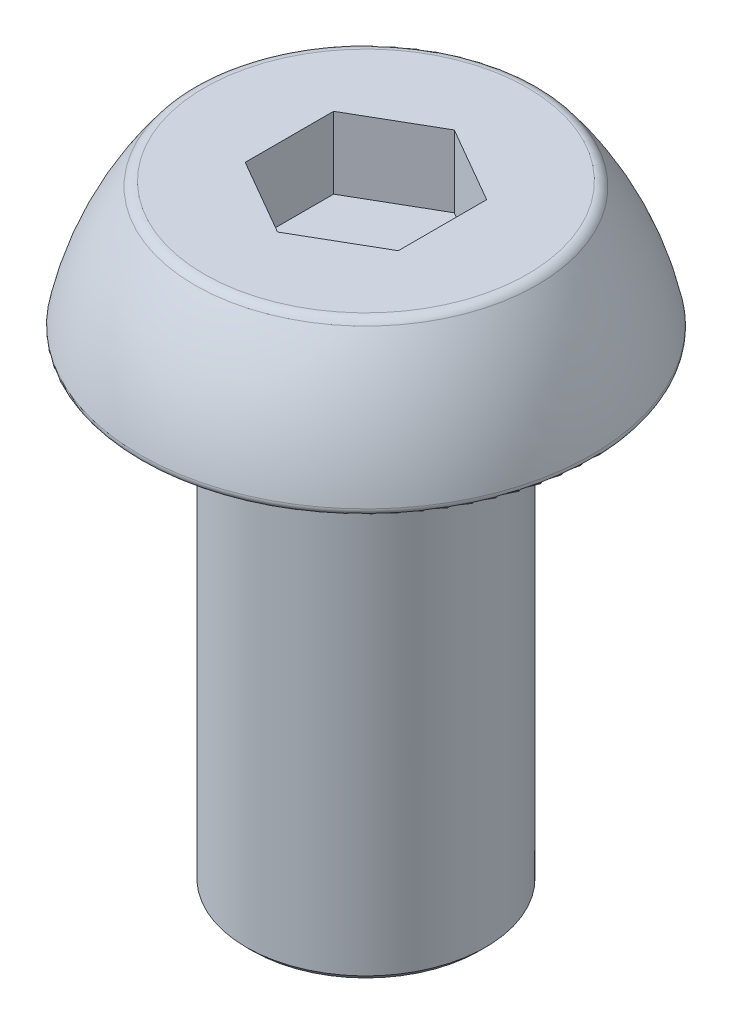
ISO-10303-21;
HEADER;
FILE_DESCRIPTION(('STEP AP214'),'2;1');
FILE_NAME('part.step','',(''),(''),'','','');
FILE_SCHEMA(('AUTOMOTIVE_DESIGN { 1 0 10303 214 1 1 1 1 }'));
ENDSEC;
DATA;
#1=APPLICATION_CONTEXT('core data for automotive mechanical design processes');
#2=APPLICATION_PROTOCOL_DEFINITION('international standard','automotive_design',2000,#1);
#3=PRODUCT_CONTEXT('',#1,'mechanical');
#4=PRODUCT('Part','Part','',(#3));
#5=PRODUCT_RELATED_PRODUCT_CATEGORY('part','',(#4));
#6=PRODUCT_DEFINITION_FORMATION('','',#4);
#7=PRODUCT_DEFINITION_CONTEXT('part definition',#1,'design');
#8=PRODUCT_DEFINITION('design','',#6,#7);
#9=PRODUCT_DEFINITION_SHAPE('','',#8);
#10=(LENGTH_UNIT() NAMED_UNIT(*) SI_UNIT(.MILLI.,.METRE.));
#11=(NAMED_UNIT(*) PLANE_ANGLE_UNIT() SI_UNIT($,.RADIAN.));
#12=(NAMED_UNIT(*) SI_UNIT($,.STERADIAN.) SOLID_ANGLE_UNIT());
#13=UNCERTAINTY_MEASURE_WITH_UNIT(LENGTH_MEASURE(1.E-05),#10,'distance_accuracy_value','');
#14=(GEOMETRIC_REPRESENTATION_CONTEXT(3) GLOBAL_UNCERTAINTY_ASSIGNED_CONTEXT((#13)) GLOBAL_UNIT_ASSIGNED_CONTEXT((#10,
#11,#12)) REPRESENTATION_CONTEXT('',''));
#15=CARTESIAN_POINT('',(0.,0.,0.));
#16=DIRECTION('',(0.,0.,1.));
#17=DIRECTION('',(1.,0.,0.));
#18=AXIS2_PLACEMENT_3D('',#15,#16,#17);
#19=CARTESIAN_POINT('',(0.,0.,0.));
#20=DIRECTION('',(0.,1.,0.));
#21=DIRECTION('',(0.,0.,1.));
#22=AXIS2_PLACEMENT_3D('',#19,#20,#21);
#23=PLANE('',#22);
#24=CARTESIAN_POINT('',(0.,0.,0.));
#25=DIRECTION('',(0.,1.,0.));
#26=DIRECTION('',(0.,0.,1.));
#27=AXIS2_PLACEMENT_3D('',#24,#25,#26);
#28=CIRCLE('',#27,3.67834475098621);
#29=CARTESIAN_POINT('',(0.,0.,3.67834475098621));
#30=VERTEX_POINT('',#29);
#31=EDGE_CURVE('E118',#30,#30,#28,.F.);
#32=ORIENTED_EDGE('',*,*,#31,.T.);
#33=EDGE_LOOP('',(#32));
#34=FACE_BOUND('',#33,.T.);
#35=CARTESIAN_POINT('',(0.,0.,0.));
#36=DIRECTION('',(0.,1.,0.));
#37=DIRECTION('',(0.,0.,1.));
#38=AXIS2_PLACEMENT_3D('',#35,#36,#37);
#39=CIRCLE('',#38,2.);
#40=CARTESIAN_POINT('',(0.,0.,2.));
#41=VERTEX_POINT('',#40);
#42=EDGE_CURVE('E137',#41,#41,#39,.F.);
#43=ORIENTED_EDGE('',*,*,#42,.F.);
#44=EDGE_LOOP('',(#43));
#45=FACE_BOUND('',#44,.T.);
#46=ADVANCED_FACE('F17',(#34,#45),#23,.F.);
#47=CARTESIAN_POINT('',(-2.8,2.2,0.));
#48=DIRECTION('',(0.,-1.,0.));
#49=DIRECTION('',(0.,0.,-1.));
#50=AXIS2_PLACEMENT_3D('',#47,#48,#49);
#51=PLANE('',#50);
#52=DIRECTION('',(-0.866025403784441,0.,0.5));
#53=VECTOR('',#52,1.);
#54=CARTESIAN_POINT('',(0.,2.2,-1.47801668912542));
#55=LINE('',#54,#53);
#56=CARTESIAN_POINT('',(0.,2.2,-1.47801668912542));
#57=VERTEX_POINT('',#56);
#58=CARTESIAN_POINT('',(-1.27999999999998,2.2,-0.739008344562711));
#59=VERTEX_POINT('',#58);
#60=EDGE_CURVE('E106',#57,#59,#55,.T.);
#61=ORIENTED_EDGE('',*,*,#60,.F.);
#62=DIRECTION('',(-0.866025403784441,0.,-0.5));
#63=VECTOR('',#62,1.);
#64=CARTESIAN_POINT('',(1.28,2.2,-0.739008344562722));
#65=LINE('',#64,#63);
#66=CARTESIAN_POINT('',(1.28,2.2,-0.739008344562722));
#67=VERTEX_POINT('',#66);
#68=EDGE_CURVE('E32',#67,#57,#65,.T.);
#69=ORIENTED_EDGE('',*,*,#68,.F.);
#70=DIRECTION('',(0.,0.,-1.));
#71=VECTOR('',#70,1.);
#72=CARTESIAN_POINT('',(1.28,2.2,0.739008344562721));
#73=LINE('',#72,#71);
#74=CARTESIAN_POINT('',(1.28,2.2,0.739008344562721));
#75=VERTEX_POINT('',#74);
#76=EDGE_CURVE('E113',#75,#67,#73,.T.);
#77=ORIENTED_EDGE('',*,*,#76,.F.);
#78=DIRECTION('',(0.866025403784439,0.,-0.5));
#79=VECTOR('',#78,1.);
#80=CARTESIAN_POINT('',(0.,2.2,1.47801668912544));
#81=LINE('',#80,#79);
#82=CARTESIAN_POINT('',(0.,2.2,1.47801668912544));
#83=VERTEX_POINT('',#82);
#84=EDGE_CURVE('E114',#83,#75,#81,.T.);
#85=ORIENTED_EDGE('',*,*,#84,.F.);
#86=DIRECTION('',(0.866025403784439,0.,0.5));
#87=VECTOR('',#86,1.);
#88=CARTESIAN_POINT('',(-1.28,2.2,0.739008344562721));
#89=LINE('',#88,#87);
#90=CARTESIAN_POINT('',(-1.28,2.2,0.739008344562721));
#91=VERTEX_POINT('',#90);
#92=EDGE_CURVE('E79',#91,#83,#89,.T.);
#93=ORIENTED_EDGE('',*,*,#92,.F.);
#94=DIRECTION('',(0.,0.,1.));
#95=VECTOR('',#94,1.);
#96=CARTESIAN_POINT('',(-1.27999999999998,2.2,-0.739008344562711));
#97=LINE('',#96,#95);
#98=EDGE_CURVE('E108',#59,#91,#97,.T.);
#99=ORIENTED_EDGE('',*,*,#98,.F.);
#100=EDGE_LOOP('',(#61,#69,#77,#85,#93,#99));
#101=FACE_BOUND('',#100,.T.);
#102=CARTESIAN_POINT('',(0.,2.2,0.));
#103=DIRECTION('',(0.,-1.,0.));
#104=DIRECTION('',(0.,0.,-1.));
#105=AXIS2_PLACEMENT_3D('',#102,#103,#104);
#106=CIRCLE('',#105,2.70215560417085);
#107=CARTESIAN_POINT('',(0.,2.2,-2.70215560417085));
#108=VERTEX_POINT('',#107);
#109=EDGE_CURVE('E132',#108,#108,#106,.F.);
#110=ORIENTED_EDGE('',*,*,#109,.T.);
#111=EDGE_LOOP('',(#110));
#112=FACE_BOUND('',#111,.T.);
#113=ADVANCED_FACE('F152',(#101,#112),#51,.F.);
#114=CARTESIAN_POINT('',(0.,-0.90769069276326,0.));
#115=DIRECTION('',(0.,-1.,0.));
#116=DIRECTION('',(0.,0.,-1.));
#117=AXIS2_PLACEMENT_3D('',#114,#115,#116);
#118=DEGENERATE_TOROIDAL_SURFACE('',#117,1.11691952407917,5.,.F.);
#119=CARTESIAN_POINT('',(0.,2.12115377886514,0.));
#120=DIRECTION('',(0.,-1.,0.));
#121=DIRECTION('',(0.,0.,-1.));
#122=AXIS2_PLACEMENT_3D('',#119,#120,#121);
#123=CIRCLE('',#122,2.8612837345146);
#124=CARTESIAN_POINT('',(0.,2.12115377886514,-2.8612837345146));
#125=VERTEX_POINT('',#124);
#126=EDGE_CURVE('E129',#125,#125,#123,.T.);
#127=ORIENTED_EDGE('',*,*,#126,.T.);
#128=EDGE_LOOP('',(#127));
#129=FACE_BOUND('',#128,.T.);
#130=CARTESIAN_POINT('',(0.,0.120565116178842,0.));
#131=DIRECTION('',(0.,-1.,0.));
#132=DIRECTION('',(0.,0.,-1.));
#133=AXIS2_PLACEMENT_3D('',#130,#131,#132);
#134=CIRCLE('',#133,3.77620728721203);
#135=CARTESIAN_POINT('',(0.,0.120565116178842,-3.77620728721203));
#136=VERTEX_POINT('',#135);
#137=EDGE_CURVE('E126',#136,#136,#134,.F.);
#138=ORIENTED_EDGE('',*,*,#137,.T.);
#139=EDGE_LOOP('',(#138));
#140=FACE_BOUND('',#139,.T.);
#141=ADVANCED_FACE('F161',(#129,#140),#118,.F.);
#142=CARTESIAN_POINT('',(0.,0.1,0.));
#143=DIRECTION('',(0.,1.,0.));
#144=DIRECTION('',(0.,0.,1.));
#145=AXIS2_PLACEMENT_3D('',#142,#143,#144);
#146=TOROIDAL_SURFACE('',#145,3.67834475098621,0.1);
#147=ORIENTED_EDGE('',*,*,#137,.F.);
#148=EDGE_LOOP('',(#147));
#149=FACE_BOUND('',#148,.T.);
#150=ORIENTED_EDGE('',*,*,#31,.F.);
#151=EDGE_LOOP('',(#150));
#152=FACE_BOUND('',#151,.T.);
#153=ADVANCED_FACE('F168',(#149,#152),#146,.T.);
#154=CARTESIAN_POINT('',(0.,2.,0.));
#155=DIRECTION('',(0.,-1.,0.));
#156=DIRECTION('',(0.,0.,-1.));
#157=AXIS2_PLACEMENT_3D('',#154,#155,#156);
#158=TOROIDAL_SURFACE('',#157,2.70215560417085,0.2);
#159=ORIENTED_EDGE('',*,*,#109,.F.);
#160=EDGE_LOOP('',(#159));
#161=FACE_BOUND('',#160,.T.);
#162=ORIENTED_EDGE('',*,*,#126,.F.);
#163=EDGE_LOOP('',(#162));
#164=FACE_BOUND('',#163,.T.);
#165=ADVANCED_FACE('F173',(#161,#164),#158,.T.);
#166=CARTESIAN_POINT('',(1.28,1.,-0.739008344562722));
#167=DIRECTION('',(0.5,0.,-0.866025403784441));
#168=DIRECTION('',(-0.866025403784441,0.,-0.5));
#169=AXIS2_PLACEMENT_3D('',#166,#167,#168);
#170=PLANE('',#169);
#171=ORIENTED_EDGE('',*,*,#68,.T.);
#172=DIRECTION('',(0.,1.,0.));
#173=VECTOR('',#172,1.);
#174=CARTESIAN_POINT('',(0.,1.,-1.47801668912542));
#175=LINE('',#174,#173);
#176=CARTESIAN_POINT('',(0.,1.,-1.47801668912542));
#177=VERTEX_POINT('',#176);
#178=EDGE_CURVE('E62',#177,#57,#175,.T.);
#179=ORIENTED_EDGE('',*,*,#178,.F.);
#180=DIRECTION('',(-0.866025403784441,0.,-0.5));
#181=VECTOR('',#180,1.);
#182=CARTESIAN_POINT('',(1.28,1.,-0.739008344562722));
#183=LINE('',#182,#181);
#184=CARTESIAN_POINT('',(1.28,1.,-0.739008344562722));
#185=VERTEX_POINT('',#184);
#186=EDGE_CURVE('E117',#185,#177,#183,.T.);
#187=ORIENTED_EDGE('',*,*,#186,.F.);
#188=DIRECTION('',(0.,1.,0.));
#189=VECTOR('',#188,1.);
#190=CARTESIAN_POINT('',(1.28,1.,-0.739008344562722));
#191=LINE('',#190,#189);
#192=EDGE_CURVE('E37',#185,#67,#191,.T.);
#193=ORIENTED_EDGE('',*,*,#192,.T.);
#194=EDGE_LOOP('',(#171,#179,#187,#193));
#195=FACE_BOUND('',#194,.T.);
#196=ADVANCED_FACE('F170',(#195),#170,.F.);
#197=CARTESIAN_POINT('',(1.28,1.,0.739008344562721));
#198=DIRECTION('',(1.,0.,0.));
#199=DIRECTION('',(0.,0.,-1.));
#200=AXIS2_PLACEMENT_3D('',#197,#198,#199);
#201=PLANE('',#200);
#202=ORIENTED_EDGE('',*,*,#76,.T.);
#203=ORIENTED_EDGE('',*,*,#192,.F.);
#204=DIRECTION('',(0.,0.,-1.));
#205=VECTOR('',#204,1.);
#206=CARTESIAN_POINT('',(1.28,1.,0.739008344562721));
#207=LINE('',#206,#205);
#208=CARTESIAN_POINT('',(1.28,1.,0.739008344562721));
#209=VERTEX_POINT('',#208);
#210=EDGE_CURVE('E95',#209,#185,#207,.T.);
#211=ORIENTED_EDGE('',*,*,#210,.F.);
#212=DIRECTION('',(0.,1.,0.));
#213=VECTOR('',#212,1.);
#214=CARTESIAN_POINT('',(1.28,1.,0.739008344562721));
#215=LINE('',#214,#213);
#216=EDGE_CURVE('E81',#209,#75,#215,.T.);
#217=ORIENTED_EDGE('',*,*,#216,.T.);
#218=EDGE_LOOP('',(#202,#203,#211,#217));
#219=FACE_BOUND('',#218,.T.);
#220=ADVANCED_FACE('F181',(#219),#201,.F.);
#221=CARTESIAN_POINT('',(0.,1.,1.47801668912544));
#222=DIRECTION('',(0.5,0.,0.866025403784439));
#223=DIRECTION('',(0.866025403784439,0.,-0.5));
#224=AXIS2_PLACEMENT_3D('',#221,#222,#223);
#225=PLANE('',#224);
#226=ORIENTED_EDGE('',*,*,#84,.T.);
#227=ORIENTED_EDGE('',*,*,#216,.F.);
#228=DIRECTION('',(0.866025403784439,0.,-0.5));
#229=VECTOR('',#228,1.);
#230=CARTESIAN_POINT('',(0.,1.,1.47801668912544));
#231=LINE('',#230,#229);
#232=CARTESIAN_POINT('',(0.,1.,1.47801668912544));
#233=VERTEX_POINT('',#232);
#234=EDGE_CURVE('E86',#233,#209,#231,.T.);
#235=ORIENTED_EDGE('',*,*,#234,.F.);
#236=DIRECTION('',(0.,1.,0.));
#237=VECTOR('',#236,1.);
#238=CARTESIAN_POINT('',(0.,1.,1.47801668912544));
#239=LINE('',#238,#237);
#240=EDGE_CURVE('E73',#233,#83,#239,.T.);
#241=ORIENTED_EDGE('',*,*,#240,.T.);
#242=EDGE_LOOP('',(#226,#227,#235,#241));
#243=FACE_BOUND('',#242,.T.);
#244=ADVANCED_FACE('F90',(#243),#225,.F.);
#245=CARTESIAN_POINT('',(-1.28,1.,0.739008344562721));
#246=DIRECTION('',(-0.5,0.,0.866025403784439));
#247=DIRECTION('',(0.866025403784439,0.,0.5));
#248=AXIS2_PLACEMENT_3D('',#245,#246,#247);
#249=PLANE('',#248);
#250=ORIENTED_EDGE('',*,*,#92,.T.);
#251=ORIENTED_EDGE('',*,*,#240,.F.);
#252=DIRECTION('',(0.866025403784439,0.,0.5));
#253=VECTOR('',#252,1.);
#254=CARTESIAN_POINT('',(-1.28,1.,0.739008344562721));
#255=LINE('',#254,#253);
#256=CARTESIAN_POINT('',(-1.28,1.,0.739008344562721));
#257=VERTEX_POINT('',#256);
#258=EDGE_CURVE('E80',#257,#233,#255,.T.);
#259=ORIENTED_EDGE('',*,*,#258,.F.);
#260=DIRECTION('',(0.,1.,0.));
#261=VECTOR('',#260,1.);
#262=CARTESIAN_POINT('',(-1.28,1.,0.739008344562721));
#263=LINE('',#262,#261);
#264=EDGE_CURVE('E83',#257,#91,#263,.T.);
#265=ORIENTED_EDGE('',*,*,#264,.T.);
#266=EDGE_LOOP('',(#250,#251,#259,#265));
#267=FACE_BOUND('',#266,.T.);
#268=ADVANCED_FACE('F74',(#267),#249,.F.);
#269=CARTESIAN_POINT('',(-1.27999999999998,1.,-0.739008344562711));
#270=DIRECTION('',(-1.,0.,0.));
#271=DIRECTION('',(0.,0.,1.));
#272=AXIS2_PLACEMENT_3D('',#269,#270,#271);
#273=PLANE('',#272);
#274=ORIENTED_EDGE('',*,*,#98,.T.);
#275=ORIENTED_EDGE('',*,*,#264,.F.);
#276=DIRECTION('',(0.,0.,1.));
#277=VECTOR('',#276,1.);
#278=CARTESIAN_POINT('',(-1.27999999999998,1.,-0.739008344562711));
#279=LINE('',#278,#277);
#280=CARTESIAN_POINT('',(-1.27999999999998,1.,-0.739008344562711));
#281=VERTEX_POINT('',#280);
#282=EDGE_CURVE('E98',#281,#257,#279,.T.);
#283=ORIENTED_EDGE('',*,*,#282,.F.);
#284=DIRECTION('',(0.,1.,0.));
#285=VECTOR('',#284,1.);
#286=CARTESIAN_POINT('',(-1.27999999999998,1.,-0.739008344562711));
#287=LINE('',#286,#285);
#288=EDGE_CURVE('E121',#281,#59,#287,.T.);
#289=ORIENTED_EDGE('',*,*,#288,.T.);
#290=EDGE_LOOP('',(#274,#275,#283,#289));
#291=FACE_BOUND('',#290,.T.);
#292=ADVANCED_FACE('F206',(#291),#273,.F.);
#293=CARTESIAN_POINT('',(0.,1.,-1.47801668912542));
#294=DIRECTION('',(-0.5,0.,-0.866025403784441));
#295=DIRECTION('',(-0.866025403784441,0.,0.5));
#296=AXIS2_PLACEMENT_3D('',#293,#294,#295);
#297=PLANE('',#296);
#298=ORIENTED_EDGE('',*,*,#60,.T.);
#299=ORIENTED_EDGE('',*,*,#288,.F.);
#300=DIRECTION('',(-0.866025403784441,0.,0.5));
#301=VECTOR('',#300,1.);
#302=CARTESIAN_POINT('',(0.,1.,-1.47801668912542));
#303=LINE('',#302,#301);
#304=EDGE_CURVE('E99',#177,#281,#303,.T.);
#305=ORIENTED_EDGE('',*,*,#304,.F.);
#306=ORIENTED_EDGE('',*,*,#178,.T.);
#307=EDGE_LOOP('',(#298,#299,#305,#306));
#308=FACE_BOUND('',#307,.T.);
#309=ADVANCED_FACE('F208',(#308),#297,.F.);
#310=CARTESIAN_POINT('',(0.,1.,0.));
#311=DIRECTION('',(0.,1.,0.));
#312=DIRECTION('',(0.,0.,1.));
#313=AXIS2_PLACEMENT_3D('',#310,#311,#312);
#314=PLANE('',#313);
#315=ORIENTED_EDGE('',*,*,#186,.T.);
#316=ORIENTED_EDGE('',*,*,#304,.T.);
#317=ORIENTED_EDGE('',*,*,#282,.T.);
#318=ORIENTED_EDGE('',*,*,#258,.T.);
#319=ORIENTED_EDGE('',*,*,#234,.T.);
#320=ORIENTED_EDGE('',*,*,#210,.T.);
#321=EDGE_LOOP('',(#315,#316,#317,#318,#319,#320));
#322=FACE_BOUND('',#321,.T.);
#323=ADVANCED_FACE('F92',(#322),#314,.T.);
#324=CARTESIAN_POINT('',(0.,-8.,0.));
#325=DIRECTION('',(0.,1.,0.));
#326=DIRECTION('',(0.,0.,1.));
#327=AXIS2_PLACEMENT_3D('',#324,#325,#326);
#328=CYLINDRICAL_SURFACE('',#327,2.);
#329=CARTESIAN_POINT('',(0.,-7.9,0.));
#330=DIRECTION('',(0.,-1.,0.));
#331=DIRECTION('',(0.,0.,-1.));
#332=AXIS2_PLACEMENT_3D('',#329,#330,#331);
#333=CIRCLE('',#332,2.);
#334=CARTESIAN_POINT('',(0.,-7.9,-2.));
#335=VERTEX_POINT('',#334);
#336=EDGE_CURVE('E11',#335,#335,#333,.F.);
#337=ORIENTED_EDGE('',*,*,#336,.T.);
#338=EDGE_LOOP('',(#337));
#339=FACE_BOUND('',#338,.T.);
#340=ORIENTED_EDGE('',*,*,#42,.T.);
#341=EDGE_LOOP('',(#340));
#342=FACE_BOUND('',#341,.T.);
#343=ADVANCED_FACE('F147',(#339,#342),#328,.T.);
#344=CARTESIAN_POINT('',(0.,-8.,0.));
#345=DIRECTION('',(0.,-1.,0.));
#346=DIRECTION('',(0.,0.,-1.));
#347=AXIS2_PLACEMENT_3D('',#344,#345,#346);
#348=PLANE('',#347);
#349=CARTESIAN_POINT('',(0.,-8.,0.));
#350=DIRECTION('',(0.,-1.,0.));
#351=DIRECTION('',(0.,0.,-1.));
#352=AXIS2_PLACEMENT_3D('',#349,#350,#351);
#353=CIRCLE('',#352,1.9);
#354=CARTESIAN_POINT('',(0.,-8.,-1.9));
#355=VERTEX_POINT('',#354);
#356=EDGE_CURVE('E25',#355,#355,#353,.T.);
#357=ORIENTED_EDGE('',*,*,#356,.T.);
#358=EDGE_LOOP('',(#357));
#359=FACE_BOUND('',#358,.T.);
#360=ADVANCED_FACE('F143',(#359),#348,.T.);
#361=CARTESIAN_POINT('',(0.,-8.,0.));
#362=DIRECTION('',(0.,1.,0.));
#363=DIRECTION('',(0.,0.,1.));
#364=AXIS2_PLACEMENT_3D('',#361,#362,#363);
#365=CONICAL_SURFACE('',#364,1.9,0.785398163397448);
#366=ORIENTED_EDGE('',*,*,#336,.F.);
#367=EDGE_LOOP('',(#366));
#368=FACE_BOUND('',#367,.T.);
#369=ORIENTED_EDGE('',*,*,#356,.F.);
#370=EDGE_LOOP('',(#369));
#371=FACE_BOUND('',#370,.T.);
#372=ADVANCED_FACE('F19',(#368,#371),#365,.T.);
#373=CLOSED_SHELL('',(#46,#113,#141,#153,#165,#196,#220,#244,#268,#292,#309,#323,#343,#360,#372));
#374=MANIFOLD_SOLID_BREP('B1',#373);
#375=ADVANCED_BREP_SHAPE_REPRESENTATION('',(#18,#374),#14);
#376=SHAPE_DEFINITION_REPRESENTATION(#9,#375);
ENDSEC;
END-ISO-10303-21;
